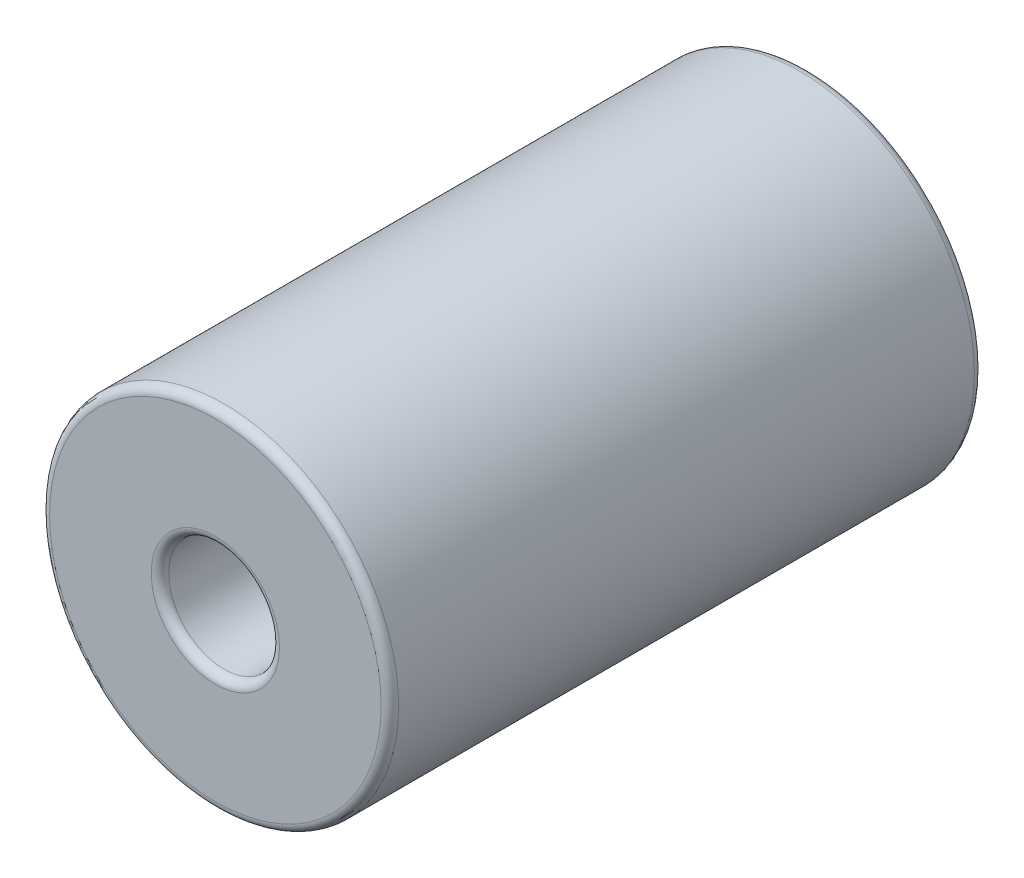
ISO-10303-21;
HEADER;
FILE_DESCRIPTION(('STEP AP214'),'2;1');
FILE_NAME('part.step','',(''),(''),'','','');
FILE_SCHEMA(('AUTOMOTIVE_DESIGN { 1 0 10303 214 1 1 1 1 }'));
ENDSEC;
DATA;
#1=APPLICATION_CONTEXT('core data for automotive mechanical design processes');
#2=APPLICATION_PROTOCOL_DEFINITION('international standard','automotive_design',2000,#1);
#3=PRODUCT_CONTEXT('',#1,'mechanical');
#4=PRODUCT('Part','Part','',(#3));
#5=PRODUCT_RELATED_PRODUCT_CATEGORY('part','',(#4));
#6=PRODUCT_DEFINITION_FORMATION('','',#4);
#7=PRODUCT_DEFINITION_CONTEXT('part definition',#1,'design');
#8=PRODUCT_DEFINITION('design','',#6,#7);
#9=PRODUCT_DEFINITION_SHAPE('','',#8);
#10=(LENGTH_UNIT() NAMED_UNIT(*) SI_UNIT(.MILLI.,.METRE.));
#11=(NAMED_UNIT(*) PLANE_ANGLE_UNIT() SI_UNIT($,.RADIAN.));
#12=(NAMED_UNIT(*) SI_UNIT($,.STERADIAN.) SOLID_ANGLE_UNIT());
#13=UNCERTAINTY_MEASURE_WITH_UNIT(LENGTH_MEASURE(1.E-05),#10,'distance_accuracy_value','');
#14=(GEOMETRIC_REPRESENTATION_CONTEXT(3) GLOBAL_UNCERTAINTY_ASSIGNED_CONTEXT((#13)) GLOBAL_UNIT_ASSIGNED_CONTEXT((#10,
#11,#12)) REPRESENTATION_CONTEXT('',''));
#15=CARTESIAN_POINT('',(0.,0.,0.));
#16=DIRECTION('',(0.,0.,1.));
#17=DIRECTION('',(1.,0.,0.));
#18=AXIS2_PLACEMENT_3D('',#15,#16,#17);
#19=CARTESIAN_POINT('',(0.,0.,34.));
#20=DIRECTION('',(0.,0.,-1.));
#21=DIRECTION('',(-1.,0.,0.));
#22=AXIS2_PLACEMENT_3D('',#19,#20,#21);
#23=CYLINDRICAL_SURFACE('',#22,10.);
#24=CARTESIAN_POINT('',(0.,0.,0.5));
#25=DIRECTION('',(0.,0.,1.));
#26=DIRECTION('',(1.,0.,0.));
#27=AXIS2_PLACEMENT_3D('',#24,#25,#26);
#28=CIRCLE('',#27,10.);
#29=CARTESIAN_POINT('',(10.,0.,0.5));
#30=VERTEX_POINT('',#29);
#31=EDGE_CURVE('E70',#30,#30,#28,.T.);
#32=ORIENTED_EDGE('',*,*,#31,.T.);
#33=EDGE_LOOP('',(#32));
#34=FACE_BOUND('',#33,.T.);
#35=CARTESIAN_POINT('',(0.,0.,33.5));
#36=DIRECTION('',(0.,0.,1.));
#37=DIRECTION('',(1.,0.,0.));
#38=AXIS2_PLACEMENT_3D('',#35,#36,#37);
#39=CIRCLE('',#38,10.);
#40=CARTESIAN_POINT('',(10.,0.,33.5));
#41=VERTEX_POINT('',#40);
#42=EDGE_CURVE('E73',#41,#41,#39,.F.);
#43=ORIENTED_EDGE('',*,*,#42,.T.);
#44=EDGE_LOOP('',(#43));
#45=FACE_BOUND('',#44,.T.);
#46=ADVANCED_FACE('F32',(#34,#45),#23,.T.);
#47=CARTESIAN_POINT('',(0.,0.,34.));
#48=DIRECTION('',(0.,0.,1.));
#49=DIRECTION('',(1.,0.,0.));
#50=AXIS2_PLACEMENT_3D('',#47,#48,#49);
#51=PLANE('',#50);
#52=CARTESIAN_POINT('',(0.,0.,34.));
#53=DIRECTION('',(0.,0.,1.));
#54=DIRECTION('',(1.,0.,0.));
#55=AXIS2_PLACEMENT_3D('',#52,#53,#54);
#56=CIRCLE('',#55,3.675);
#57=CARTESIAN_POINT('',(3.675,0.,34.));
#58=VERTEX_POINT('',#57);
#59=EDGE_CURVE('E58',#58,#58,#56,.F.);
#60=ORIENTED_EDGE('',*,*,#59,.T.);
#61=EDGE_LOOP('',(#60));
#62=FACE_BOUND('',#61,.T.);
#63=CARTESIAN_POINT('',(0.,0.,34.));
#64=DIRECTION('',(0.,0.,1.));
#65=DIRECTION('',(1.,0.,0.));
#66=AXIS2_PLACEMENT_3D('',#63,#64,#65);
#67=CIRCLE('',#66,9.5);
#68=CARTESIAN_POINT('',(9.5,0.,34.));
#69=VERTEX_POINT('',#68);
#70=EDGE_CURVE('E64',#69,#69,#67,.T.);
#71=ORIENTED_EDGE('',*,*,#70,.T.);
#72=EDGE_LOOP('',(#71));
#73=FACE_BOUND('',#72,.T.);
#74=ADVANCED_FACE('F86',(#62,#73),#51,.T.);
#75=CARTESIAN_POINT('',(0.,0.,0.));
#76=DIRECTION('',(0.,0.,1.));
#77=DIRECTION('',(1.,0.,0.));
#78=AXIS2_PLACEMENT_3D('',#75,#76,#77);
#79=PLANE('',#78);
#80=CARTESIAN_POINT('',(0.,0.,0.));
#81=DIRECTION('',(0.,0.,1.));
#82=DIRECTION('',(1.,0.,0.));
#83=AXIS2_PLACEMENT_3D('',#80,#81,#82);
#84=CIRCLE('',#83,4.5);
#85=CARTESIAN_POINT('',(4.5,0.,0.));
#86=VERTEX_POINT('',#85);
#87=EDGE_CURVE('E52',#86,#86,#84,.T.);
#88=ORIENTED_EDGE('',*,*,#87,.T.);
#89=EDGE_LOOP('',(#88));
#90=FACE_BOUND('',#89,.T.);
#91=CARTESIAN_POINT('',(0.,0.,0.));
#92=DIRECTION('',(0.,0.,1.));
#93=DIRECTION('',(1.,0.,0.));
#94=AXIS2_PLACEMENT_3D('',#91,#92,#93);
#95=CIRCLE('',#94,9.5);
#96=CARTESIAN_POINT('',(9.5,0.,0.));
#97=VERTEX_POINT('',#96);
#98=EDGE_CURVE('E67',#97,#97,#95,.F.);
#99=ORIENTED_EDGE('',*,*,#98,.T.);
#100=EDGE_LOOP('',(#99));
#101=FACE_BOUND('',#100,.T.);
#102=ADVANCED_FACE('F88',(#90,#101),#79,.F.);
#103=CARTESIAN_POINT('',(0.,0.,23.));
#104=DIRECTION('',(0.,0.,1.));
#105=DIRECTION('',(1.,0.,0.));
#106=AXIS2_PLACEMENT_3D('',#103,#104,#105);
#107=CYLINDRICAL_SURFACE('',#106,3.175);
#108=CARTESIAN_POINT('',(0.,0.,23.5));
#109=DIRECTION('',(0.,0.,1.));
#110=DIRECTION('',(1.,0.,0.));
#111=AXIS2_PLACEMENT_3D('',#108,#109,#110);
#112=CIRCLE('',#111,3.175);
#113=CARTESIAN_POINT('',(3.175,0.,23.5));
#114=VERTEX_POINT('',#113);
#115=EDGE_CURVE('E43',#114,#114,#112,.F.);
#116=ORIENTED_EDGE('',*,*,#115,.T.);
#117=EDGE_LOOP('',(#116));
#118=FACE_BOUND('',#117,.T.);
#119=CARTESIAN_POINT('',(0.,0.,33.5));
#120=DIRECTION('',(0.,0.,1.));
#121=DIRECTION('',(1.,0.,0.));
#122=AXIS2_PLACEMENT_3D('',#119,#120,#121);
#123=CIRCLE('',#122,3.175);
#124=CARTESIAN_POINT('',(3.175,0.,33.5));
#125=VERTEX_POINT('',#124);
#126=EDGE_CURVE('E61',#125,#125,#123,.T.);
#127=ORIENTED_EDGE('',*,*,#126,.T.);
#128=EDGE_LOOP('',(#127));
#129=FACE_BOUND('',#128,.T.);
#130=ADVANCED_FACE('F95',(#118,#129),#107,.F.);
#131=CARTESIAN_POINT('',(0.,0.,23.));
#132=DIRECTION('',(0.,0.,1.));
#133=DIRECTION('',(1.,0.,0.));
#134=AXIS2_PLACEMENT_3D('',#131,#132,#133);
#135=PLANE('',#134);
#136=CARTESIAN_POINT('',(0.,0.,23.));
#137=DIRECTION('',(0.,0.,1.));
#138=DIRECTION('',(1.,0.,0.));
#139=AXIS2_PLACEMENT_3D('',#136,#137,#138);
#140=CIRCLE('',#139,2.675);
#141=CARTESIAN_POINT('',(2.675,0.,23.));
#142=VERTEX_POINT('',#141);
#143=EDGE_CURVE('E47',#142,#142,#140,.T.);
#144=ORIENTED_EDGE('',*,*,#143,.T.);
#145=EDGE_LOOP('',(#144));
#146=FACE_BOUND('',#145,.T.);
#147=ADVANCED_FACE('F124',(#146),#135,.T.);
#148=CARTESIAN_POINT('',(0.,0.,11.));
#149=DIRECTION('',(0.,0.,-1.));
#150=DIRECTION('',(-1.,0.,0.));
#151=AXIS2_PLACEMENT_3D('',#148,#149,#150);
#152=CYLINDRICAL_SURFACE('',#151,4.);
#153=CARTESIAN_POINT('',(0.,0.,10.5));
#154=DIRECTION('',(0.,0.,-1.));
#155=DIRECTION('',(-1.,0.,0.));
#156=AXIS2_PLACEMENT_3D('',#153,#154,#155);
#157=CIRCLE('',#156,4.);
#158=CARTESIAN_POINT('',(-4.,0.,10.5));
#159=VERTEX_POINT('',#158);
#160=EDGE_CURVE('E10',#159,#159,#157,.F.);
#161=ORIENTED_EDGE('',*,*,#160,.T.);
#162=EDGE_LOOP('',(#161));
#163=FACE_BOUND('',#162,.T.);
#164=CARTESIAN_POINT('',(0.,0.,0.5));
#165=DIRECTION('',(0.,0.,1.));
#166=DIRECTION('',(1.,0.,0.));
#167=AXIS2_PLACEMENT_3D('',#164,#165,#166);
#168=CIRCLE('',#167,4.);
#169=CARTESIAN_POINT('',(4.,0.,0.5));
#170=VERTEX_POINT('',#169);
#171=EDGE_CURVE('E55',#170,#170,#168,.F.);
#172=ORIENTED_EDGE('',*,*,#171,.T.);
#173=EDGE_LOOP('',(#172));
#174=FACE_BOUND('',#173,.T.);
#175=ADVANCED_FACE('F126',(#163,#174),#152,.F.);
#176=CARTESIAN_POINT('',(0.,0.,11.));
#177=DIRECTION('',(0.,0.,-1.));
#178=DIRECTION('',(-1.,0.,0.));
#179=AXIS2_PLACEMENT_3D('',#176,#177,#178);
#180=PLANE('',#179);
#181=CARTESIAN_POINT('',(0.,0.,11.));
#182=DIRECTION('',(0.,0.,-1.));
#183=DIRECTION('',(-1.,0.,0.));
#184=AXIS2_PLACEMENT_3D('',#181,#182,#183);
#185=CIRCLE('',#184,3.5);
#186=CARTESIAN_POINT('',(-3.5,0.,11.));
#187=VERTEX_POINT('',#186);
#188=EDGE_CURVE('E39',#187,#187,#185,.T.);
#189=ORIENTED_EDGE('',*,*,#188,.T.);
#190=EDGE_LOOP('',(#189));
#191=FACE_BOUND('',#190,.T.);
#192=ADVANCED_FACE('F104',(#191),#180,.T.);
#193=CARTESIAN_POINT('',(0.,0.,0.5));
#194=DIRECTION('',(0.,0.,1.));
#195=DIRECTION('',(1.,0.,0.));
#196=AXIS2_PLACEMENT_3D('',#193,#194,#195);
#197=TOROIDAL_SURFACE('',#196,9.5,0.5);
#198=ORIENTED_EDGE('',*,*,#98,.F.);
#199=EDGE_LOOP('',(#198));
#200=FACE_BOUND('',#199,.T.);
#201=ORIENTED_EDGE('',*,*,#31,.F.);
#202=EDGE_LOOP('',(#201));
#203=FACE_BOUND('',#202,.T.);
#204=ADVANCED_FACE('F82',(#200,#203),#197,.T.);
#205=CARTESIAN_POINT('',(0.,0.,33.5));
#206=DIRECTION('',(0.,0.,1.));
#207=DIRECTION('',(1.,0.,0.));
#208=AXIS2_PLACEMENT_3D('',#205,#206,#207);
#209=TOROIDAL_SURFACE('',#208,9.5,0.5);
#210=ORIENTED_EDGE('',*,*,#42,.F.);
#211=EDGE_LOOP('',(#210));
#212=FACE_BOUND('',#211,.T.);
#213=ORIENTED_EDGE('',*,*,#70,.F.);
#214=EDGE_LOOP('',(#213));
#215=FACE_BOUND('',#214,.T.);
#216=ADVANCED_FACE('F78',(#212,#215),#209,.T.);
#217=CARTESIAN_POINT('',(0.,0.,33.5));
#218=DIRECTION('',(0.,0.,1.));
#219=DIRECTION('',(1.,0.,0.));
#220=AXIS2_PLACEMENT_3D('',#217,#218,#219);
#221=TOROIDAL_SURFACE('',#220,3.675,0.5);
#222=ORIENTED_EDGE('',*,*,#59,.F.);
#223=EDGE_LOOP('',(#222));
#224=FACE_BOUND('',#223,.T.);
#225=ORIENTED_EDGE('',*,*,#126,.F.);
#226=EDGE_LOOP('',(#225));
#227=FACE_BOUND('',#226,.T.);
#228=ADVANCED_FACE('F81',(#224,#227),#221,.T.);
#229=CARTESIAN_POINT('',(0.,0.,0.5));
#230=DIRECTION('',(0.,0.,1.));
#231=DIRECTION('',(1.,0.,0.));
#232=AXIS2_PLACEMENT_3D('',#229,#230,#231);
#233=TOROIDAL_SURFACE('',#232,4.5,0.5);
#234=ORIENTED_EDGE('',*,*,#87,.F.);
#235=EDGE_LOOP('',(#234));
#236=FACE_BOUND('',#235,.T.);
#237=ORIENTED_EDGE('',*,*,#171,.F.);
#238=EDGE_LOOP('',(#237));
#239=FACE_BOUND('',#238,.T.);
#240=ADVANCED_FACE('F109',(#236,#239),#233,.T.);
#241=CARTESIAN_POINT('',(0.,0.,23.5));
#242=DIRECTION('',(0.,0.,1.));
#243=DIRECTION('',(1.,0.,0.));
#244=AXIS2_PLACEMENT_3D('',#241,#242,#243);
#245=TOROIDAL_SURFACE('',#244,2.675,0.5);
#246=ORIENTED_EDGE('',*,*,#115,.F.);
#247=EDGE_LOOP('',(#246));
#248=FACE_BOUND('',#247,.T.);
#249=ORIENTED_EDGE('',*,*,#143,.F.);
#250=EDGE_LOOP('',(#249));
#251=FACE_BOUND('',#250,.T.);
#252=ADVANCED_FACE('F112',(#248,#251),#245,.F.);
#253=CARTESIAN_POINT('',(0.,0.,10.5));
#254=DIRECTION('',(0.,0.,-1.));
#255=DIRECTION('',(-1.,0.,0.));
#256=AXIS2_PLACEMENT_3D('',#253,#254,#255);
#257=TOROIDAL_SURFACE('',#256,3.5,0.5);
#258=ORIENTED_EDGE('',*,*,#160,.F.);
#259=EDGE_LOOP('',(#258));
#260=FACE_BOUND('',#259,.T.);
#261=ORIENTED_EDGE('',*,*,#188,.F.);
#262=EDGE_LOOP('',(#261));
#263=FACE_BOUND('',#262,.T.);
#264=ADVANCED_FACE('F34',(#260,#263),#257,.F.);
#265=CLOSED_SHELL('',(#46,#74,#102,#130,#147,#175,#192,#204,#216,#228,#240,#252,#264));
#266=MANIFOLD_SOLID_BREP('B2',#265);
#267=ADVANCED_BREP_SHAPE_REPRESENTATION('',(#18,#266),#14);
#268=SHAPE_DEFINITION_REPRESENTATION(#9,#267);
ENDSEC;
END-ISO-10303-21;
